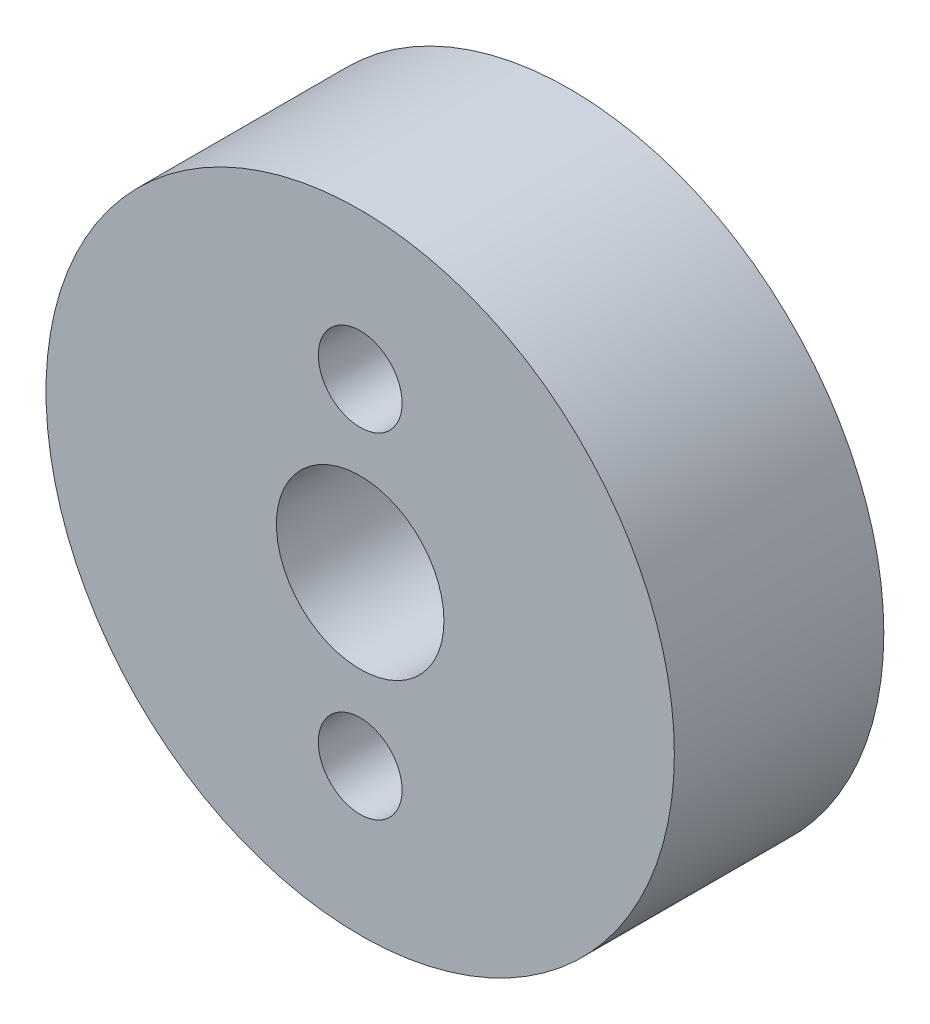
ISO-10303-21;
HEADER;
FILE_DESCRIPTION(('STEP AP214'),'2;1');
FILE_NAME('part.step','',(''),(''),'','','');
FILE_SCHEMA(('AUTOMOTIVE_DESIGN { 1 0 10303 214 1 1 1 1 }'));
ENDSEC;
DATA;
#1=APPLICATION_CONTEXT('core data for automotive mechanical design processes');
#2=APPLICATION_PROTOCOL_DEFINITION('international standard','automotive_design',2000,#1);
#3=PRODUCT_CONTEXT('',#1,'mechanical');
#4=PRODUCT('Part','Part','',(#3));
#5=PRODUCT_RELATED_PRODUCT_CATEGORY('part','',(#4));
#6=PRODUCT_DEFINITION_FORMATION('','',#4);
#7=PRODUCT_DEFINITION_CONTEXT('part definition',#1,'design');
#8=PRODUCT_DEFINITION('design','',#6,#7);
#9=PRODUCT_DEFINITION_SHAPE('','',#8);
#10=(LENGTH_UNIT() NAMED_UNIT(*) SI_UNIT(.MILLI.,.METRE.));
#11=(NAMED_UNIT(*) PLANE_ANGLE_UNIT() SI_UNIT($,.RADIAN.));
#12=(NAMED_UNIT(*) SI_UNIT($,.STERADIAN.) SOLID_ANGLE_UNIT());
#13=UNCERTAINTY_MEASURE_WITH_UNIT(LENGTH_MEASURE(1.E-05),#10,'distance_accuracy_value','');
#14=(GEOMETRIC_REPRESENTATION_CONTEXT(3) GLOBAL_UNCERTAINTY_ASSIGNED_CONTEXT((#13)) GLOBAL_UNIT_ASSIGNED_CONTEXT((#10,
#11,#12)) REPRESENTATION_CONTEXT('',''));
#15=CARTESIAN_POINT('',(0.,0.,0.));
#16=DIRECTION('',(0.,0.,1.));
#17=DIRECTION('',(1.,0.,0.));
#18=AXIS2_PLACEMENT_3D('',#15,#16,#17);
#19=CARTESIAN_POINT('',(0.,0.,5.));
#20=DIRECTION('',(0.,0.,1.));
#21=DIRECTION('',(1.,0.,0.));
#22=AXIS2_PLACEMENT_3D('',#19,#20,#21);
#23=PLANE('',#22);
#24=CARTESIAN_POINT('',(0.,4.,5.));
#25=DIRECTION('',(0.,0.,1.));
#26=DIRECTION('',(1.,0.,0.));
#27=AXIS2_PLACEMENT_3D('',#24,#25,#26);
#28=CIRCLE('',#27,0.999999999999987);
#29=CARTESIAN_POINT('',(0.999999999999987,4.,5.));
#30=VERTEX_POINT('',#29);
#31=EDGE_CURVE('E75',#30,#30,#28,.T.);
#32=ORIENTED_EDGE('',*,*,#31,.F.);
#33=EDGE_LOOP('',(#32));
#34=FACE_BOUND('',#33,.T.);
#35=CARTESIAN_POINT('',(0.,-4.,5.));
#36=DIRECTION('',(0.,0.,1.));
#37=DIRECTION('',(1.,0.,0.));
#38=AXIS2_PLACEMENT_3D('',#35,#36,#37);
#39=CIRCLE('',#38,0.999999999999987);
#40=CARTESIAN_POINT('',(0.999999999999987,-4.,5.));
#41=VERTEX_POINT('',#40);
#42=EDGE_CURVE('E68',#41,#41,#39,.T.);
#43=ORIENTED_EDGE('',*,*,#42,.F.);
#44=EDGE_LOOP('',(#43));
#45=FACE_BOUND('',#44,.T.);
#46=CARTESIAN_POINT('',(0.,0.,5.));
#47=DIRECTION('',(0.,0.,1.));
#48=DIRECTION('',(1.,0.,0.));
#49=AXIS2_PLACEMENT_3D('',#46,#47,#48);
#50=CIRCLE('',#49,7.5);
#51=CARTESIAN_POINT('',(7.5,0.,5.));
#52=VERTEX_POINT('',#51);
#53=EDGE_CURVE('E11',#52,#52,#50,.T.);
#54=ORIENTED_EDGE('',*,*,#53,.T.);
#55=EDGE_LOOP('',(#54));
#56=FACE_BOUND('',#55,.T.);
#57=CARTESIAN_POINT('',(0.,0.,5.));
#58=DIRECTION('',(0.,0.,1.));
#59=DIRECTION('',(1.,0.,0.));
#60=AXIS2_PLACEMENT_3D('',#57,#58,#59);
#61=CIRCLE('',#60,2.);
#62=CARTESIAN_POINT('',(2.,0.,5.));
#63=VERTEX_POINT('',#62);
#64=EDGE_CURVE('E57',#63,#63,#61,.T.);
#65=ORIENTED_EDGE('',*,*,#64,.F.);
#66=EDGE_LOOP('',(#65));
#67=FACE_BOUND('',#66,.T.);
#68=ADVANCED_FACE('F44',(#34,#45,#56,#67),#23,.T.);
#69=CARTESIAN_POINT('',(0.,0.,0.));
#70=DIRECTION('',(0.,0.,1.));
#71=DIRECTION('',(1.,0.,0.));
#72=AXIS2_PLACEMENT_3D('',#69,#70,#71);
#73=PLANE('',#72);
#74=CARTESIAN_POINT('',(0.,4.,0.));
#75=DIRECTION('',(0.,0.,1.));
#76=DIRECTION('',(1.,0.,0.));
#77=AXIS2_PLACEMENT_3D('',#74,#75,#76);
#78=CIRCLE('',#77,0.999999999999999);
#79=CARTESIAN_POINT('',(0.999999999999999,4.,0.));
#80=VERTEX_POINT('',#79);
#81=EDGE_CURVE('E67',#80,#80,#78,.T.);
#82=ORIENTED_EDGE('',*,*,#81,.T.);
#83=EDGE_LOOP('',(#82));
#84=FACE_BOUND('',#83,.T.);
#85=CARTESIAN_POINT('',(0.,-4.,0.));
#86=DIRECTION('',(0.,0.,1.));
#87=DIRECTION('',(1.,0.,0.));
#88=AXIS2_PLACEMENT_3D('',#85,#86,#87);
#89=CIRCLE('',#88,0.999999999999999);
#90=CARTESIAN_POINT('',(0.999999999999999,-4.,0.));
#91=VERTEX_POINT('',#90);
#92=EDGE_CURVE('E63',#91,#91,#89,.T.);
#93=ORIENTED_EDGE('',*,*,#92,.T.);
#94=EDGE_LOOP('',(#93));
#95=FACE_BOUND('',#94,.T.);
#96=CARTESIAN_POINT('',(0.,0.,0.));
#97=DIRECTION('',(0.,0.,1.));
#98=DIRECTION('',(1.,0.,0.));
#99=AXIS2_PLACEMENT_3D('',#96,#97,#98);
#100=CIRCLE('',#99,7.5);
#101=CARTESIAN_POINT('',(7.5,0.,0.));
#102=VERTEX_POINT('',#101);
#103=EDGE_CURVE('E47',#102,#102,#100,.T.);
#104=ORIENTED_EDGE('',*,*,#103,.F.);
#105=EDGE_LOOP('',(#104));
#106=FACE_BOUND('',#105,.T.);
#107=CARTESIAN_POINT('',(0.,0.,0.));
#108=DIRECTION('',(0.,0.,1.));
#109=DIRECTION('',(1.,0.,0.));
#110=AXIS2_PLACEMENT_3D('',#107,#108,#109);
#111=CIRCLE('',#110,2.);
#112=CARTESIAN_POINT('',(2.,0.,0.));
#113=VERTEX_POINT('',#112);
#114=EDGE_CURVE('E59',#113,#113,#111,.T.);
#115=ORIENTED_EDGE('',*,*,#114,.T.);
#116=EDGE_LOOP('',(#115));
#117=FACE_BOUND('',#116,.T.);
#118=ADVANCED_FACE('F76',(#84,#95,#106,#117),#73,.F.);
#119=CARTESIAN_POINT('',(0.,0.,5.));
#120=DIRECTION('',(0.,0.,-1.));
#121=DIRECTION('',(-1.,0.,0.));
#122=AXIS2_PLACEMENT_3D('',#119,#120,#121);
#123=CYLINDRICAL_SURFACE('',#122,7.5);
#124=ORIENTED_EDGE('',*,*,#53,.F.);
#125=EDGE_LOOP('',(#124));
#126=FACE_BOUND('',#125,.T.);
#127=ORIENTED_EDGE('',*,*,#103,.T.);
#128=EDGE_LOOP('',(#127));
#129=FACE_BOUND('',#128,.T.);
#130=ADVANCED_FACE('F50',(#126,#129),#123,.T.);
#131=CARTESIAN_POINT('',(0.,0.,5.));
#132=DIRECTION('',(0.,0.,-1.));
#133=DIRECTION('',(-1.,0.,0.));
#134=AXIS2_PLACEMENT_3D('',#131,#132,#133);
#135=CYLINDRICAL_SURFACE('',#134,2.);
#136=ORIENTED_EDGE('',*,*,#64,.T.);
#137=EDGE_LOOP('',(#136));
#138=FACE_BOUND('',#137,.T.);
#139=ORIENTED_EDGE('',*,*,#114,.F.);
#140=EDGE_LOOP('',(#139));
#141=FACE_BOUND('',#140,.T.);
#142=ADVANCED_FACE('F88',(#138,#141),#135,.F.);
#143=CARTESIAN_POINT('',(0.,-4.,5.));
#144=DIRECTION('',(0.,0.,1.));
#145=DIRECTION('',(1.,0.,0.));
#146=AXIS2_PLACEMENT_3D('',#143,#144,#145);
#147=CYLINDRICAL_SURFACE('',#146,0.999999999999993);
#148=ORIENTED_EDGE('',*,*,#92,.F.);
#149=EDGE_LOOP('',(#148));
#150=FACE_BOUND('',#149,.T.);
#151=ORIENTED_EDGE('',*,*,#42,.T.);
#152=EDGE_LOOP('',(#151));
#153=FACE_BOUND('',#152,.T.);
#154=ADVANCED_FACE('F90',(#150,#153),#147,.F.);
#155=CARTESIAN_POINT('',(0.,4.,5.));
#156=DIRECTION('',(0.,0.,1.));
#157=DIRECTION('',(1.,0.,0.));
#158=AXIS2_PLACEMENT_3D('',#155,#156,#157);
#159=CYLINDRICAL_SURFACE('',#158,0.999999999999993);
#160=ORIENTED_EDGE('',*,*,#81,.F.);
#161=EDGE_LOOP('',(#160));
#162=FACE_BOUND('',#161,.T.);
#163=ORIENTED_EDGE('',*,*,#31,.T.);
#164=EDGE_LOOP('',(#163));
#165=FACE_BOUND('',#164,.T.);
#166=ADVANCED_FACE('F78',(#162,#165),#159,.F.);
#167=CLOSED_SHELL('',(#68,#118,#130,#142,#154,#166));
#168=MANIFOLD_SOLID_BREP('B2',#167);
#169=ADVANCED_BREP_SHAPE_REPRESENTATION('',(#18,#168),#14);
#170=SHAPE_DEFINITION_REPRESENTATION(#9,#169);
ENDSEC;
END-ISO-10303-21;
